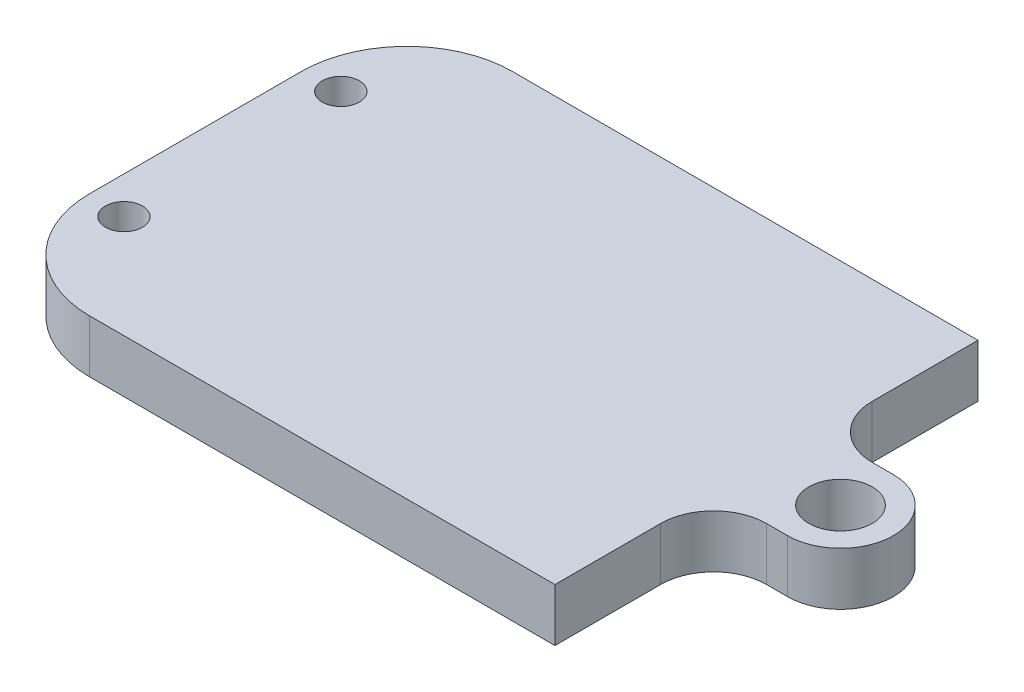
ISO-10303-21;
HEADER;
FILE_DESCRIPTION(('STEP AP214'),'2;1');
FILE_NAME('part.step','',(''),(''),'','','');
FILE_SCHEMA(('AUTOMOTIVE_DESIGN { 1 0 10303 214 1 1 1 1 }'));
ENDSEC;
DATA;
#1=APPLICATION_CONTEXT('core data for automotive mechanical design processes');
#2=APPLICATION_PROTOCOL_DEFINITION('international standard','automotive_design',2000,#1);
#3=PRODUCT_CONTEXT('',#1,'mechanical');
#4=PRODUCT('Part','Part','',(#3));
#5=PRODUCT_RELATED_PRODUCT_CATEGORY('part','',(#4));
#6=PRODUCT_DEFINITION_FORMATION('','',#4);
#7=PRODUCT_DEFINITION_CONTEXT('part definition',#1,'design');
#8=PRODUCT_DEFINITION('design','',#6,#7);
#9=PRODUCT_DEFINITION_SHAPE('','',#8);
#10=(LENGTH_UNIT() NAMED_UNIT(*) SI_UNIT(.MILLI.,.METRE.));
#11=(NAMED_UNIT(*) PLANE_ANGLE_UNIT() SI_UNIT($,.RADIAN.));
#12=(NAMED_UNIT(*) SI_UNIT($,.STERADIAN.) SOLID_ANGLE_UNIT());
#13=UNCERTAINTY_MEASURE_WITH_UNIT(LENGTH_MEASURE(1.E-05),#10,'distance_accuracy_value','');
#14=(GEOMETRIC_REPRESENTATION_CONTEXT(3) GLOBAL_UNCERTAINTY_ASSIGNED_CONTEXT((#13)) GLOBAL_UNIT_ASSIGNED_CONTEXT((#10,
#11,#12)) REPRESENTATION_CONTEXT('',''));
#15=CARTESIAN_POINT('',(0.,0.,0.));
#16=DIRECTION('',(0.,0.,1.));
#17=DIRECTION('',(1.,0.,0.));
#18=AXIS2_PLACEMENT_3D('',#15,#16,#17);
#19=CARTESIAN_POINT('',(26.5,5.,-20.));
#20=DIRECTION('',(-1.,0.,0.));
#21=DIRECTION('',(0.,0.,1.));
#22=AXIS2_PLACEMENT_3D('',#19,#20,#21);
#23=PLANE('',#22);
#24=DIRECTION('',(0.,0.,-1.));
#25=VECTOR('',#24,1.);
#26=CARTESIAN_POINT('',(26.5,5.,-20.));
#27=LINE('',#26,#25);
#28=CARTESIAN_POINT('',(26.5,5.,-10.));
#29=VERTEX_POINT('',#28);
#30=CARTESIAN_POINT('',(26.5,5.,-20.));
#31=VERTEX_POINT('',#30);
#32=EDGE_CURVE('E198',#29,#31,#27,.T.);
#33=ORIENTED_EDGE('',*,*,#32,.F.);
#34=DIRECTION('',(0.,1.,0.));
#35=VECTOR('',#34,1.);
#36=CARTESIAN_POINT('',(26.5,5.,-10.));
#37=LINE('',#36,#35);
#38=CARTESIAN_POINT('',(26.5,0.,-10.));
#39=VERTEX_POINT('',#38);
#40=EDGE_CURVE('E64',#29,#39,#37,.F.);
#41=ORIENTED_EDGE('',*,*,#40,.T.);
#42=DIRECTION('',(0.,0.,-1.));
#43=VECTOR('',#42,1.);
#44=CARTESIAN_POINT('',(26.5,0.,-20.));
#45=LINE('',#44,#43);
#46=CARTESIAN_POINT('',(26.5,0.,-20.));
#47=VERTEX_POINT('',#46);
#48=EDGE_CURVE('E182',#39,#47,#45,.T.);
#49=ORIENTED_EDGE('',*,*,#48,.T.);
#50=DIRECTION('',(0.,-1.,0.));
#51=VECTOR('',#50,1.);
#52=CARTESIAN_POINT('',(26.5,5.,-20.));
#53=LINE('',#52,#51);
#54=EDGE_CURVE('E220',#31,#47,#53,.T.);
#55=ORIENTED_EDGE('',*,*,#54,.F.);
#56=EDGE_LOOP('',(#33,#41,#49,#55));
#57=FACE_BOUND('',#56,.T.);
#58=ADVANCED_FACE('F42',(#57),#23,.F.);
#59=CARTESIAN_POINT('',(26.5,0.,20.));
#60=VERTEX_POINT('',#59);
#61=CARTESIAN_POINT('',(26.5,0.,10.));
#62=VERTEX_POINT('',#61);
#63=EDGE_CURVE('E206',#60,#62,#45,.T.);
#64=ORIENTED_EDGE('',*,*,#63,.T.);
#65=DIRECTION('',(0.,1.,0.));
#66=VECTOR('',#65,1.);
#67=CARTESIAN_POINT('',(26.5,5.,10.));
#68=LINE('',#67,#66);
#69=CARTESIAN_POINT('',(26.5,5.,10.));
#70=VERTEX_POINT('',#69);
#71=EDGE_CURVE('E250',#62,#70,#68,.T.);
#72=ORIENTED_EDGE('',*,*,#71,.T.);
#73=CARTESIAN_POINT('',(26.5,5.,20.));
#74=VERTEX_POINT('',#73);
#75=EDGE_CURVE('E194',#74,#70,#27,.T.);
#76=ORIENTED_EDGE('',*,*,#75,.F.);
#77=DIRECTION('',(0.,-1.,0.));
#78=VECTOR('',#77,1.);
#79=CARTESIAN_POINT('',(26.5,5.,20.));
#80=LINE('',#79,#78);
#81=EDGE_CURVE('E205',#74,#60,#80,.T.);
#82=ORIENTED_EDGE('',*,*,#81,.T.);
#83=EDGE_LOOP('',(#64,#72,#76,#82));
#84=FACE_BOUND('',#83,.T.);
#85=ADVANCED_FACE('F311',(#84),#23,.F.);
#86=CARTESIAN_POINT('',(-26.5,5.,-20.));
#87=DIRECTION('',(0.,0.,1.));
#88=DIRECTION('',(1.,0.,0.));
#89=AXIS2_PLACEMENT_3D('',#86,#87,#88);
#90=PLANE('',#89);
#91=DIRECTION('',(-1.,0.,0.));
#92=VECTOR('',#91,1.);
#93=CARTESIAN_POINT('',(-26.5,0.,-20.));
#94=LINE('',#93,#92);
#95=CARTESIAN_POINT('',(-17.5,0.,-20.));
#96=VERTEX_POINT('',#95);
#97=EDGE_CURVE('E210',#47,#96,#94,.T.);
#98=ORIENTED_EDGE('',*,*,#97,.T.);
#99=DIRECTION('',(0.,-1.,0.));
#100=VECTOR('',#99,1.);
#101=CARTESIAN_POINT('',(-17.5,5.,-20.));
#102=LINE('',#101,#100);
#103=CARTESIAN_POINT('',(-17.5,5.,-20.));
#104=VERTEX_POINT('',#103);
#105=EDGE_CURVE('E247',#96,#104,#102,.F.);
#106=ORIENTED_EDGE('',*,*,#105,.T.);
#107=DIRECTION('',(-1.,0.,0.));
#108=VECTOR('',#107,1.);
#109=CARTESIAN_POINT('',(-26.5,5.,-20.));
#110=LINE('',#109,#108);
#111=EDGE_CURVE('E197',#31,#104,#110,.T.);
#112=ORIENTED_EDGE('',*,*,#111,.F.);
#113=ORIENTED_EDGE('',*,*,#54,.T.);
#114=EDGE_LOOP('',(#98,#106,#112,#113));
#115=FACE_BOUND('',#114,.T.);
#116=ADVANCED_FACE('F316',(#115),#90,.F.);
#117=CARTESIAN_POINT('',(-26.5,5.,20.));
#118=DIRECTION('',(0.,0.,-1.));
#119=DIRECTION('',(-1.,0.,0.));
#120=AXIS2_PLACEMENT_3D('',#117,#118,#119);
#121=PLANE('',#120);
#122=DIRECTION('',(1.,0.,0.));
#123=VECTOR('',#122,1.);
#124=CARTESIAN_POINT('',(-26.5,5.,20.));
#125=LINE('',#124,#123);
#126=CARTESIAN_POINT('',(-17.5,5.,20.));
#127=VERTEX_POINT('',#126);
#128=EDGE_CURVE('E202',#127,#74,#125,.T.);
#129=ORIENTED_EDGE('',*,*,#128,.F.);
#130=DIRECTION('',(0.,1.,0.));
#131=VECTOR('',#130,1.);
#132=CARTESIAN_POINT('',(-17.5,0.,20.));
#133=LINE('',#132,#131);
#134=CARTESIAN_POINT('',(-17.5,0.,20.));
#135=VERTEX_POINT('',#134);
#136=EDGE_CURVE('E238',#127,#135,#133,.F.);
#137=ORIENTED_EDGE('',*,*,#136,.T.);
#138=DIRECTION('',(1.,0.,0.));
#139=VECTOR('',#138,1.);
#140=CARTESIAN_POINT('',(-26.5,0.,20.));
#141=LINE('',#140,#139);
#142=EDGE_CURVE('E214',#135,#60,#141,.T.);
#143=ORIENTED_EDGE('',*,*,#142,.T.);
#144=ORIENTED_EDGE('',*,*,#81,.F.);
#145=EDGE_LOOP('',(#129,#137,#143,#144));
#146=FACE_BOUND('',#145,.T.);
#147=ADVANCED_FACE('F289',(#146),#121,.F.);
#148=CARTESIAN_POINT('',(0.,5.,0.));
#149=DIRECTION('',(0.,1.,0.));
#150=DIRECTION('',(0.,0.,1.));
#151=AXIS2_PLACEMENT_3D('',#148,#149,#150);
#152=PLANE('',#151);
#153=CARTESIAN_POINT('',(33.5,5.,0.));
#154=DIRECTION('',(0.,1.,0.));
#155=DIRECTION('',(0.,0.,1.));
#156=AXIS2_PLACEMENT_3D('',#153,#154,#155);
#157=CIRCLE('',#156,3.);
#158=CARTESIAN_POINT('',(33.5,5.,3.));
#159=VERTEX_POINT('',#158);
#160=EDGE_CURVE('E254',#159,#159,#157,.T.);
#161=ORIENTED_EDGE('',*,*,#160,.F.);
#162=EDGE_LOOP('',(#161));
#163=FACE_BOUND('',#162,.T.);
#164=CARTESIAN_POINT('',(-24.,5.,-10.252098));
#165=DIRECTION('',(0.,1.,0.));
#166=DIRECTION('',(0.,0.,1.));
#167=AXIS2_PLACEMENT_3D('',#164,#165,#166);
#168=CIRCLE('',#167,1.75);
#169=CARTESIAN_POINT('',(-24.,5.,-8.502098));
#170=VERTEX_POINT('',#169);
#171=EDGE_CURVE('E183',#170,#170,#168,.T.);
#172=ORIENTED_EDGE('',*,*,#171,.F.);
#173=EDGE_LOOP('',(#172));
#174=FACE_BOUND('',#173,.T.);
#175=CARTESIAN_POINT('',(-24.,5.,10.252098));
#176=DIRECTION('',(0.,1.,0.));
#177=DIRECTION('',(0.,0.,1.));
#178=AXIS2_PLACEMENT_3D('',#175,#176,#177);
#179=CIRCLE('',#178,1.75);
#180=CARTESIAN_POINT('',(-24.,5.,12.002098));
#181=VERTEX_POINT('',#180);
#182=EDGE_CURVE('E187',#181,#181,#179,.T.);
#183=ORIENTED_EDGE('',*,*,#182,.F.);
#184=EDGE_LOOP('',(#183));
#185=FACE_BOUND('',#184,.T.);
#186=DIRECTION('',(0.,0.,-1.));
#187=VECTOR('',#186,1.);
#188=CARTESIAN_POINT('',(-27.5,5.,-20.));
#189=LINE('',#188,#187);
#190=CARTESIAN_POINT('',(-27.5,5.,10.));
#191=VERTEX_POINT('',#190);
#192=CARTESIAN_POINT('',(-27.5,5.,-9.99999999999999));
#193=VERTEX_POINT('',#192);
#194=EDGE_CURVE('E173',#191,#193,#189,.T.);
#195=ORIENTED_EDGE('',*,*,#194,.F.);
#196=CARTESIAN_POINT('',(-17.5,5.,10.));
#197=DIRECTION('',(0.,1.,0.));
#198=DIRECTION('',(0.,0.,1.));
#199=AXIS2_PLACEMENT_3D('',#196,#197,#198);
#200=CIRCLE('',#199,10.);
#201=EDGE_CURVE('E235',#191,#127,#200,.T.);
#202=ORIENTED_EDGE('',*,*,#201,.T.);
#203=ORIENTED_EDGE('',*,*,#128,.T.);
#204=ORIENTED_EDGE('',*,*,#75,.T.);
#205=CARTESIAN_POINT('',(31.5,5.,10.));
#206=DIRECTION('',(0.,1.,0.));
#207=DIRECTION('',(0.,0.,1.));
#208=AXIS2_PLACEMENT_3D('',#205,#206,#207);
#209=CIRCLE('',#208,5.);
#210=CARTESIAN_POINT('',(31.5,5.,5.));
#211=VERTEX_POINT('',#210);
#212=EDGE_CURVE('E137',#70,#211,#209,.F.);
#213=ORIENTED_EDGE('',*,*,#212,.T.);
#214=DIRECTION('',(1.,0.,0.));
#215=VECTOR('',#214,1.);
#216=CARTESIAN_POINT('',(26.5,5.,5.));
#217=LINE('',#216,#215);
#218=CARTESIAN_POINT('',(33.5,5.,5.));
#219=VERTEX_POINT('',#218);
#220=EDGE_CURVE('E129',#211,#219,#217,.T.);
#221=ORIENTED_EDGE('',*,*,#220,.T.);
#222=CARTESIAN_POINT('',(33.5,5.,0.));
#223=DIRECTION('',(0.,1.,0.));
#224=DIRECTION('',(0.,0.,-1.));
#225=AXIS2_PLACEMENT_3D('',#222,#223,#224);
#226=CIRCLE('',#225,5.);
#227=CARTESIAN_POINT('',(33.5,5.,-5.));
#228=VERTEX_POINT('',#227);
#229=EDGE_CURVE('E134',#219,#228,#226,.T.);
#230=ORIENTED_EDGE('',*,*,#229,.T.);
#231=DIRECTION('',(-1.,0.,0.));
#232=VECTOR('',#231,1.);
#233=CARTESIAN_POINT('',(26.5,5.,-5.));
#234=LINE('',#233,#232);
#235=CARTESIAN_POINT('',(31.5,5.,-5.));
#236=VERTEX_POINT('',#235);
#237=EDGE_CURVE('E153',#228,#236,#234,.T.);
#238=ORIENTED_EDGE('',*,*,#237,.T.);
#239=CARTESIAN_POINT('',(31.5,5.,-10.));
#240=DIRECTION('',(0.,1.,0.));
#241=DIRECTION('',(0.,0.,1.));
#242=AXIS2_PLACEMENT_3D('',#239,#240,#241);
#243=CIRCLE('',#242,5.);
#244=EDGE_CURVE('E51',#236,#29,#243,.F.);
#245=ORIENTED_EDGE('',*,*,#244,.T.);
#246=ORIENTED_EDGE('',*,*,#32,.T.);
#247=ORIENTED_EDGE('',*,*,#111,.T.);
#248=CARTESIAN_POINT('',(-17.5,5.,-10.));
#249=DIRECTION('',(0.,1.,0.));
#250=DIRECTION('',(0.,0.,1.));
#251=AXIS2_PLACEMENT_3D('',#248,#249,#250);
#252=CIRCLE('',#251,10.);
#253=EDGE_CURVE('E232',#104,#193,#252,.T.);
#254=ORIENTED_EDGE('',*,*,#253,.T.);
#255=EDGE_LOOP('',(#195,#202,#203,#204,#213,#221,#230,#238,#245,#246,#247,#254));
#256=FACE_BOUND('',#255,.T.);
#257=ADVANCED_FACE('F132',(#163,#174,#185,#256),#152,.T.);
#258=CARTESIAN_POINT('',(0.,0.,0.));
#259=DIRECTION('',(0.,1.,0.));
#260=DIRECTION('',(0.,0.,1.));
#261=AXIS2_PLACEMENT_3D('',#258,#259,#260);
#262=PLANE('',#261);
#263=CARTESIAN_POINT('',(33.5,0.,0.));
#264=DIRECTION('',(0.,1.,0.));
#265=DIRECTION('',(0.,0.,1.));
#266=AXIS2_PLACEMENT_3D('',#263,#264,#265);
#267=CIRCLE('',#266,3.);
#268=CARTESIAN_POINT('',(33.5,0.,3.));
#269=VERTEX_POINT('',#268);
#270=EDGE_CURVE('E141',#269,#269,#267,.T.);
#271=ORIENTED_EDGE('',*,*,#270,.T.);
#272=EDGE_LOOP('',(#271));
#273=FACE_BOUND('',#272,.T.);
#274=CARTESIAN_POINT('',(-24.,0.,-10.252098));
#275=DIRECTION('',(0.,1.,0.));
#276=DIRECTION('',(0.,0.,1.));
#277=AXIS2_PLACEMENT_3D('',#274,#275,#276);
#278=CIRCLE('',#277,1.75);
#279=CARTESIAN_POINT('',(-24.,0.,-8.502098));
#280=VERTEX_POINT('',#279);
#281=EDGE_CURVE('E178',#280,#280,#278,.T.);
#282=ORIENTED_EDGE('',*,*,#281,.T.);
#283=EDGE_LOOP('',(#282));
#284=FACE_BOUND('',#283,.T.);
#285=CARTESIAN_POINT('',(-24.,0.,10.252098));
#286=DIRECTION('',(0.,1.,0.));
#287=DIRECTION('',(0.,0.,1.));
#288=AXIS2_PLACEMENT_3D('',#285,#286,#287);
#289=CIRCLE('',#288,1.75);
#290=CARTESIAN_POINT('',(-24.,0.,12.002098));
#291=VERTEX_POINT('',#290);
#292=EDGE_CURVE('E177',#291,#291,#289,.T.);
#293=ORIENTED_EDGE('',*,*,#292,.T.);
#294=EDGE_LOOP('',(#293));
#295=FACE_BOUND('',#294,.T.);
#296=ORIENTED_EDGE('',*,*,#142,.F.);
#297=CARTESIAN_POINT('',(-17.5,0.,10.));
#298=DIRECTION('',(0.,1.,0.));
#299=DIRECTION('',(0.,0.,1.));
#300=AXIS2_PLACEMENT_3D('',#297,#298,#299);
#301=CIRCLE('',#300,10.);
#302=CARTESIAN_POINT('',(-27.5,0.,10.));
#303=VERTEX_POINT('',#302);
#304=EDGE_CURVE('E244',#135,#303,#301,.F.);
#305=ORIENTED_EDGE('',*,*,#304,.T.);
#306=DIRECTION('',(0.,0.,1.));
#307=VECTOR('',#306,1.);
#308=CARTESIAN_POINT('',(-27.5,0.,-20.));
#309=LINE('',#308,#307);
#310=CARTESIAN_POINT('',(-27.5,0.,-9.99999999999999));
#311=VERTEX_POINT('',#310);
#312=EDGE_CURVE('E168',#311,#303,#309,.T.);
#313=ORIENTED_EDGE('',*,*,#312,.F.);
#314=CARTESIAN_POINT('',(-17.5,0.,-10.));
#315=DIRECTION('',(0.,1.,0.));
#316=DIRECTION('',(0.,0.,1.));
#317=AXIS2_PLACEMENT_3D('',#314,#315,#316);
#318=CIRCLE('',#317,10.);
#319=EDGE_CURVE('E241',#311,#96,#318,.F.);
#320=ORIENTED_EDGE('',*,*,#319,.T.);
#321=ORIENTED_EDGE('',*,*,#97,.F.);
#322=ORIENTED_EDGE('',*,*,#48,.F.);
#323=CARTESIAN_POINT('',(31.5,0.,-10.));
#324=DIRECTION('',(0.,1.,0.));
#325=DIRECTION('',(0.,0.,1.));
#326=AXIS2_PLACEMENT_3D('',#323,#324,#325);
#327=CIRCLE('',#326,5.);
#328=CARTESIAN_POINT('',(31.5,0.,-5.));
#329=VERTEX_POINT('',#328);
#330=EDGE_CURVE('E11',#39,#329,#327,.T.);
#331=ORIENTED_EDGE('',*,*,#330,.T.);
#332=DIRECTION('',(1.,0.,0.));
#333=VECTOR('',#332,1.);
#334=CARTESIAN_POINT('',(26.5,0.,-5.));
#335=LINE('',#334,#333);
#336=CARTESIAN_POINT('',(33.5,0.,-5.));
#337=VERTEX_POINT('',#336);
#338=EDGE_CURVE('E169',#329,#337,#335,.T.);
#339=ORIENTED_EDGE('',*,*,#338,.T.);
#340=CARTESIAN_POINT('',(33.5,0.,0.));
#341=DIRECTION('',(0.,1.,0.));
#342=DIRECTION('',(0.,0.,1.));
#343=AXIS2_PLACEMENT_3D('',#340,#341,#342);
#344=CIRCLE('',#343,5.);
#345=CARTESIAN_POINT('',(33.5,0.,5.));
#346=VERTEX_POINT('',#345);
#347=EDGE_CURVE('E164',#337,#346,#344,.F.);
#348=ORIENTED_EDGE('',*,*,#347,.T.);
#349=DIRECTION('',(-1.,0.,0.));
#350=VECTOR('',#349,1.);
#351=CARTESIAN_POINT('',(26.5,0.,5.));
#352=LINE('',#351,#350);
#353=CARTESIAN_POINT('',(31.5,0.,5.));
#354=VERTEX_POINT('',#353);
#355=EDGE_CURVE('E148',#346,#354,#352,.T.);
#356=ORIENTED_EDGE('',*,*,#355,.T.);
#357=CARTESIAN_POINT('',(31.5,0.,10.));
#358=DIRECTION('',(0.,1.,0.));
#359=DIRECTION('',(0.,0.,1.));
#360=AXIS2_PLACEMENT_3D('',#357,#358,#359);
#361=CIRCLE('',#360,5.);
#362=EDGE_CURVE('E269',#354,#62,#361,.T.);
#363=ORIENTED_EDGE('',*,*,#362,.T.);
#364=ORIENTED_EDGE('',*,*,#63,.F.);
#365=EDGE_LOOP('',(#296,#305,#313,#320,#321,#322,#331,#339,#348,#356,#363,#364));
#366=FACE_BOUND('',#365,.T.);
#367=ADVANCED_FACE('F288',(#273,#284,#295,#366),#262,.F.);
#368=CARTESIAN_POINT('',(-24.,0.,10.252098));
#369=DIRECTION('',(0.,1.,0.));
#370=DIRECTION('',(0.,0.,1.));
#371=AXIS2_PLACEMENT_3D('',#368,#369,#370);
#372=CYLINDRICAL_SURFACE('',#371,1.75);
#373=ORIENTED_EDGE('',*,*,#292,.F.);
#374=EDGE_LOOP('',(#373));
#375=FACE_BOUND('',#374,.T.);
#376=ORIENTED_EDGE('',*,*,#182,.T.);
#377=EDGE_LOOP('',(#376));
#378=FACE_BOUND('',#377,.T.);
#379=ADVANCED_FACE('F295',(#375,#378),#372,.F.);
#380=CARTESIAN_POINT('',(-24.,0.,-10.252098));
#381=DIRECTION('',(0.,1.,0.));
#382=DIRECTION('',(0.,0.,1.));
#383=AXIS2_PLACEMENT_3D('',#380,#381,#382);
#384=CYLINDRICAL_SURFACE('',#383,1.75);
#385=ORIENTED_EDGE('',*,*,#281,.F.);
#386=EDGE_LOOP('',(#385));
#387=FACE_BOUND('',#386,.T.);
#388=ORIENTED_EDGE('',*,*,#171,.T.);
#389=EDGE_LOOP('',(#388));
#390=FACE_BOUND('',#389,.T.);
#391=ADVANCED_FACE('F297',(#387,#390),#384,.F.);
#392=CARTESIAN_POINT('',(-27.5,0.,0.));
#393=DIRECTION('',(-1.,0.,0.));
#394=DIRECTION('',(0.,0.,1.));
#395=AXIS2_PLACEMENT_3D('',#392,#393,#394);
#396=PLANE('',#395);
#397=ORIENTED_EDGE('',*,*,#312,.T.);
#398=DIRECTION('',(0.,1.,0.));
#399=VECTOR('',#398,1.);
#400=CARTESIAN_POINT('',(-27.5,5.,10.));
#401=LINE('',#400,#399);
#402=EDGE_CURVE('E228',#303,#191,#401,.T.);
#403=ORIENTED_EDGE('',*,*,#402,.T.);
#404=ORIENTED_EDGE('',*,*,#194,.T.);
#405=DIRECTION('',(0.,-1.,0.));
#406=VECTOR('',#405,1.);
#407=CARTESIAN_POINT('',(-27.5,0.,-9.99999999999999));
#408=LINE('',#407,#406);
#409=EDGE_CURVE('E224',#193,#311,#408,.T.);
#410=ORIENTED_EDGE('',*,*,#409,.T.);
#411=EDGE_LOOP('',(#397,#403,#404,#410));
#412=FACE_BOUND('',#411,.T.);
#413=ADVANCED_FACE('F304',(#412),#396,.T.);
#414=CARTESIAN_POINT('',(-17.5,0.,10.));
#415=DIRECTION('',(0.,-1.,0.));
#416=DIRECTION('',(0.,0.,-1.));
#417=AXIS2_PLACEMENT_3D('',#414,#415,#416);
#418=CYLINDRICAL_SURFACE('',#417,10.);
#419=ORIENTED_EDGE('',*,*,#304,.F.);
#420=ORIENTED_EDGE('',*,*,#136,.F.);
#421=ORIENTED_EDGE('',*,*,#201,.F.);
#422=ORIENTED_EDGE('',*,*,#402,.F.);
#423=EDGE_LOOP('',(#419,#420,#421,#422));
#424=FACE_BOUND('',#423,.T.);
#425=ADVANCED_FACE('F321',(#424),#418,.T.);
#426=CARTESIAN_POINT('',(-17.5,0.,-10.));
#427=DIRECTION('',(0.,1.,0.));
#428=DIRECTION('',(0.,0.,1.));
#429=AXIS2_PLACEMENT_3D('',#426,#427,#428);
#430=CYLINDRICAL_SURFACE('',#429,10.);
#431=ORIENTED_EDGE('',*,*,#253,.F.);
#432=ORIENTED_EDGE('',*,*,#105,.F.);
#433=ORIENTED_EDGE('',*,*,#319,.F.);
#434=ORIENTED_EDGE('',*,*,#409,.F.);
#435=EDGE_LOOP('',(#431,#432,#433,#434));
#436=FACE_BOUND('',#435,.T.);
#437=ADVANCED_FACE('F324',(#436),#430,.T.);
#438=CARTESIAN_POINT('',(26.5,-15.6204993518133,-5.));
#439=DIRECTION('',(0.,0.,-1.));
#440=DIRECTION('',(-1.,0.,0.));
#441=AXIS2_PLACEMENT_3D('',#438,#439,#440);
#442=PLANE('',#441);
#443=ORIENTED_EDGE('',*,*,#338,.F.);
#444=DIRECTION('',(0.,1.,0.));
#445=VECTOR('',#444,1.);
#446=CARTESIAN_POINT('',(31.5,-15.6204993518133,-5.));
#447=LINE('',#446,#445);
#448=EDGE_CURVE('E261',#329,#236,#447,.T.);
#449=ORIENTED_EDGE('',*,*,#448,.T.);
#450=ORIENTED_EDGE('',*,*,#237,.F.);
#451=DIRECTION('',(0.,1.,0.));
#452=VECTOR('',#451,1.);
#453=CARTESIAN_POINT('',(33.5,-15.6204993518133,-5.));
#454=LINE('',#453,#452);
#455=EDGE_CURVE('E152',#337,#228,#454,.T.);
#456=ORIENTED_EDGE('',*,*,#455,.F.);
#457=EDGE_LOOP('',(#443,#449,#450,#456));
#458=FACE_BOUND('',#457,.T.);
#459=ADVANCED_FACE('F327',(#458),#442,.T.);
#460=CARTESIAN_POINT('',(33.5,-15.6204993518133,0.));
#461=DIRECTION('',(0.,1.,0.));
#462=DIRECTION('',(0.,0.,1.));
#463=AXIS2_PLACEMENT_3D('',#460,#461,#462);
#464=CYLINDRICAL_SURFACE('',#463,5.);
#465=ORIENTED_EDGE('',*,*,#347,.F.);
#466=ORIENTED_EDGE('',*,*,#455,.T.);
#467=ORIENTED_EDGE('',*,*,#229,.F.);
#468=DIRECTION('',(0.,1.,0.));
#469=VECTOR('',#468,1.);
#470=CARTESIAN_POINT('',(33.5,-15.6204993518133,5.));
#471=LINE('',#470,#469);
#472=EDGE_CURVE('E145',#346,#219,#471,.T.);
#473=ORIENTED_EDGE('',*,*,#472,.F.);
#474=EDGE_LOOP('',(#465,#466,#467,#473));
#475=FACE_BOUND('',#474,.T.);
#476=ADVANCED_FACE('F155',(#475),#464,.T.);
#477=CARTESIAN_POINT('',(26.5,-15.6204993518133,5.));
#478=DIRECTION('',(0.,0.,1.));
#479=DIRECTION('',(1.,0.,0.));
#480=AXIS2_PLACEMENT_3D('',#477,#478,#479);
#481=PLANE('',#480);
#482=ORIENTED_EDGE('',*,*,#220,.F.);
#483=DIRECTION('',(0.,1.,0.));
#484=VECTOR('',#483,1.);
#485=CARTESIAN_POINT('',(31.5,-15.6204993518133,5.));
#486=LINE('',#485,#484);
#487=EDGE_CURVE('E258',#211,#354,#486,.F.);
#488=ORIENTED_EDGE('',*,*,#487,.T.);
#489=ORIENTED_EDGE('',*,*,#355,.F.);
#490=ORIENTED_EDGE('',*,*,#472,.T.);
#491=EDGE_LOOP('',(#482,#488,#489,#490));
#492=FACE_BOUND('',#491,.T.);
#493=ADVANCED_FACE('F146',(#492),#481,.T.);
#494=CARTESIAN_POINT('',(33.5,-2.,0.));
#495=DIRECTION('',(0.,1.,0.));
#496=DIRECTION('',(0.,0.,1.));
#497=AXIS2_PLACEMENT_3D('',#494,#495,#496);
#498=CYLINDRICAL_SURFACE('',#497,3.);
#499=ORIENTED_EDGE('',*,*,#160,.T.);
#500=EDGE_LOOP('',(#499));
#501=FACE_BOUND('',#500,.T.);
#502=ORIENTED_EDGE('',*,*,#270,.F.);
#503=EDGE_LOOP('',(#502));
#504=FACE_BOUND('',#503,.T.);
#505=ADVANCED_FACE('F283',(#501,#504),#498,.F.);
#506=CARTESIAN_POINT('',(31.5,5.,10.));
#507=DIRECTION('',(0.,1.,0.));
#508=DIRECTION('',(0.,0.,1.));
#509=AXIS2_PLACEMENT_3D('',#506,#507,#508);
#510=CYLINDRICAL_SURFACE('',#509,5.);
#511=ORIENTED_EDGE('',*,*,#362,.F.);
#512=ORIENTED_EDGE('',*,*,#487,.F.);
#513=ORIENTED_EDGE('',*,*,#212,.F.);
#514=ORIENTED_EDGE('',*,*,#71,.F.);
#515=EDGE_LOOP('',(#511,#512,#513,#514));
#516=FACE_BOUND('',#515,.T.);
#517=ADVANCED_FACE('F329',(#516),#510,.F.);
#518=CARTESIAN_POINT('',(31.5,-15.6204993518133,-10.));
#519=DIRECTION('',(0.,1.,0.));
#520=DIRECTION('',(0.,0.,1.));
#521=AXIS2_PLACEMENT_3D('',#518,#519,#520);
#522=CYLINDRICAL_SURFACE('',#521,5.);
#523=ORIENTED_EDGE('',*,*,#330,.F.);
#524=ORIENTED_EDGE('',*,*,#40,.F.);
#525=ORIENTED_EDGE('',*,*,#244,.F.);
#526=ORIENTED_EDGE('',*,*,#448,.F.);
#527=EDGE_LOOP('',(#523,#524,#525,#526));
#528=FACE_BOUND('',#527,.T.);
#529=ADVANCED_FACE('F44',(#528),#522,.F.);
#530=CLOSED_SHELL('',(#58,#85,#116,#147,#257,#367,#379,#391,#413,#425,#437,#459,#476,#493,#505,
#517,#529));
#531=MANIFOLD_SOLID_BREP('B2',#530);
#532=ADVANCED_BREP_SHAPE_REPRESENTATION('',(#18,#531),#14);
#533=SHAPE_DEFINITION_REPRESENTATION(#9,#532);
ENDSEC;
END-ISO-10303-21;
